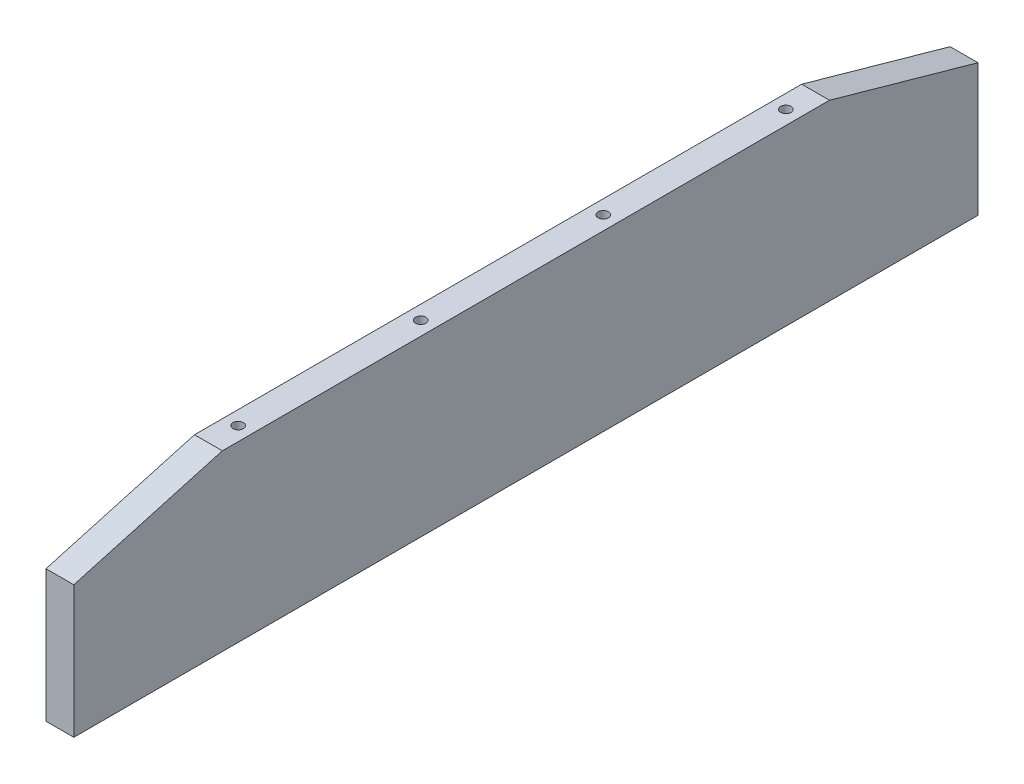
ISO-10303-21;
HEADER;
FILE_DESCRIPTION(('STEP AP214'),'2;1');
FILE_NAME('part.step','',(''),(''),'','','');
FILE_SCHEMA(('AUTOMOTIVE_DESIGN { 1 0 10303 214 1 1 1 1 }'));
ENDSEC;
DATA;
#1=APPLICATION_CONTEXT('core data for automotive mechanical design processes');
#2=APPLICATION_PROTOCOL_DEFINITION('international standard','automotive_design',2000,#1);
#3=PRODUCT_CONTEXT('',#1,'mechanical');
#4=PRODUCT('Part','Part','',(#3));
#5=PRODUCT_RELATED_PRODUCT_CATEGORY('part','',(#4));
#6=PRODUCT_DEFINITION_FORMATION('','',#4);
#7=PRODUCT_DEFINITION_CONTEXT('part definition',#1,'design');
#8=PRODUCT_DEFINITION('design','',#6,#7);
#9=PRODUCT_DEFINITION_SHAPE('','',#8);
#10=(LENGTH_UNIT() NAMED_UNIT(*) SI_UNIT(.MILLI.,.METRE.));
#11=(NAMED_UNIT(*) PLANE_ANGLE_UNIT() SI_UNIT($,.RADIAN.));
#12=(NAMED_UNIT(*) SI_UNIT($,.STERADIAN.) SOLID_ANGLE_UNIT());
#13=UNCERTAINTY_MEASURE_WITH_UNIT(LENGTH_MEASURE(1.E-05),#10,'distance_accuracy_value','');
#14=(GEOMETRIC_REPRESENTATION_CONTEXT(3) GLOBAL_UNCERTAINTY_ASSIGNED_CONTEXT((#13)) GLOBAL_UNIT_ASSIGNED_CONTEXT((#10,
#11,#12)) REPRESENTATION_CONTEXT('',''));
#15=CARTESIAN_POINT('',(0.,0.,0.));
#16=DIRECTION('',(0.,0.,1.));
#17=DIRECTION('',(1.,0.,0.));
#18=AXIS2_PLACEMENT_3D('',#15,#16,#17);
#19=CARTESIAN_POINT('',(8.,37.9952514413731,25.));
#20=DIRECTION('',(0.,0.,-1.));
#21=DIRECTION('',(0.,1.,0.));
#22=AXIS2_PLACEMENT_3D('',#19,#20,#21);
#23=PLANE('',#22);
#24=DIRECTION('',(0.,-1.,0.));
#25=VECTOR('',#24,1.);
#26=CARTESIAN_POINT('',(0.,37.9952514413731,25.));
#27=LINE('',#26,#25);
#28=CARTESIAN_POINT('',(0.,37.9952514413731,25.));
#29=VERTEX_POINT('',#28);
#30=CARTESIAN_POINT('',(0.,0.,25.));
#31=VERTEX_POINT('',#30);
#32=EDGE_CURVE('E117',#29,#31,#27,.T.);
#33=ORIENTED_EDGE('',*,*,#32,.T.);
#34=DIRECTION('',(-1.,0.,0.));
#35=VECTOR('',#34,1.);
#36=CARTESIAN_POINT('',(8.,0.,25.));
#37=LINE('',#36,#35);
#38=CARTESIAN_POINT('',(8.,0.,25.));
#39=VERTEX_POINT('',#38);
#40=EDGE_CURVE('E11',#39,#31,#37,.T.);
#41=ORIENTED_EDGE('',*,*,#40,.F.);
#42=DIRECTION('',(0.,-1.,0.));
#43=VECTOR('',#42,1.);
#44=CARTESIAN_POINT('',(8.,37.9952514413731,25.));
#45=LINE('',#44,#43);
#46=CARTESIAN_POINT('',(8.,37.9952514413731,25.));
#47=VERTEX_POINT('',#46);
#48=EDGE_CURVE('E128',#47,#39,#45,.T.);
#49=ORIENTED_EDGE('',*,*,#48,.F.);
#50=DIRECTION('',(-1.,0.,0.));
#51=VECTOR('',#50,1.);
#52=CARTESIAN_POINT('',(8.,37.9952514413731,25.));
#53=LINE('',#52,#51);
#54=EDGE_CURVE('E113',#47,#29,#53,.T.);
#55=ORIENTED_EDGE('',*,*,#54,.T.);
#56=EDGE_LOOP('',(#33,#41,#49,#55));
#57=FACE_BOUND('',#56,.T.);
#58=ADVANCED_FACE('F33',(#57),#23,.F.);
#59=CARTESIAN_POINT('',(8.,0.,25.));
#60=DIRECTION('',(0.,1.,0.));
#61=DIRECTION('',(0.,0.,1.));
#62=AXIS2_PLACEMENT_3D('',#59,#60,#61);
#63=PLANE('',#62);
#64=CARTESIAN_POINT('',(4.,0.,-183.75));
#65=DIRECTION('',(0.,-1.,0.));
#66=DIRECTION('',(0.,0.,-1.));
#67=AXIS2_PLACEMENT_3D('',#64,#65,#66);
#68=CIRCLE('',#67,1.5);
#69=CARTESIAN_POINT('',(4.,0.,-185.25));
#70=VERTEX_POINT('',#69);
#71=EDGE_CURVE('E242',#70,#70,#68,.T.);
#72=ORIENTED_EDGE('',*,*,#71,.F.);
#73=EDGE_LOOP('',(#72));
#74=FACE_BOUND('',#73,.T.);
#75=CARTESIAN_POINT('',(4.,0.,-131.25));
#76=DIRECTION('',(0.,-1.,0.));
#77=DIRECTION('',(0.,0.,-1.));
#78=AXIS2_PLACEMENT_3D('',#75,#76,#77);
#79=CIRCLE('',#78,1.5);
#80=CARTESIAN_POINT('',(4.,0.,-132.75));
#81=VERTEX_POINT('',#80);
#82=EDGE_CURVE('E244',#81,#81,#79,.T.);
#83=ORIENTED_EDGE('',*,*,#82,.F.);
#84=EDGE_LOOP('',(#83));
#85=FACE_BOUND('',#84,.T.);
#86=CARTESIAN_POINT('',(4.,0.,-78.75));
#87=DIRECTION('',(0.,-1.,0.));
#88=DIRECTION('',(0.,0.,-1.));
#89=AXIS2_PLACEMENT_3D('',#86,#87,#88);
#90=CIRCLE('',#89,1.5);
#91=CARTESIAN_POINT('',(4.,0.,-80.25));
#92=VERTEX_POINT('',#91);
#93=EDGE_CURVE('E250',#92,#92,#90,.T.);
#94=ORIENTED_EDGE('',*,*,#93,.F.);
#95=EDGE_LOOP('',(#94));
#96=FACE_BOUND('',#95,.T.);
#97=CARTESIAN_POINT('',(4.,0.,-26.25));
#98=DIRECTION('',(0.,-1.,0.));
#99=DIRECTION('',(0.,0.,-1.));
#100=AXIS2_PLACEMENT_3D('',#97,#98,#99);
#101=CIRCLE('',#100,1.5);
#102=CARTESIAN_POINT('',(4.,0.,-27.75));
#103=VERTEX_POINT('',#102);
#104=EDGE_CURVE('E256',#103,#103,#101,.T.);
#105=ORIENTED_EDGE('',*,*,#104,.F.);
#106=EDGE_LOOP('',(#105));
#107=FACE_BOUND('',#106,.T.);
#108=DIRECTION('',(0.,0.,-1.));
#109=VECTOR('',#108,1.);
#110=CARTESIAN_POINT('',(0.,0.,25.));
#111=LINE('',#110,#109);
#112=CARTESIAN_POINT('',(0.,0.,-235.));
#113=VERTEX_POINT('',#112);
#114=EDGE_CURVE('E120',#31,#113,#111,.T.);
#115=ORIENTED_EDGE('',*,*,#114,.T.);
#116=DIRECTION('',(-1.,0.,0.));
#117=VECTOR('',#116,1.);
#118=CARTESIAN_POINT('',(8.,0.,-235.));
#119=LINE('',#118,#117);
#120=CARTESIAN_POINT('',(8.,0.,-235.));
#121=VERTEX_POINT('',#120);
#122=EDGE_CURVE('E41',#121,#113,#119,.T.);
#123=ORIENTED_EDGE('',*,*,#122,.F.);
#124=DIRECTION('',(0.,0.,-1.));
#125=VECTOR('',#124,1.);
#126=CARTESIAN_POINT('',(8.,0.,25.));
#127=LINE('',#126,#125);
#128=EDGE_CURVE('E86',#39,#121,#127,.T.);
#129=ORIENTED_EDGE('',*,*,#128,.F.);
#130=ORIENTED_EDGE('',*,*,#40,.T.);
#131=EDGE_LOOP('',(#115,#123,#129,#130));
#132=FACE_BOUND('',#131,.T.);
#133=ADVANCED_FACE('F153',(#74,#85,#96,#107,#132),#63,.F.);
#134=CARTESIAN_POINT('',(8.,0.,-235.));
#135=DIRECTION('',(0.,0.,1.));
#136=DIRECTION('',(1.,0.,0.));
#137=AXIS2_PLACEMENT_3D('',#134,#135,#136);
#138=PLANE('',#137);
#139=DIRECTION('',(0.,1.,0.));
#140=VECTOR('',#139,1.);
#141=CARTESIAN_POINT('',(0.,0.,-235.));
#142=LINE('',#141,#140);
#143=CARTESIAN_POINT('',(0.,37.9952514413731,-235.));
#144=VERTEX_POINT('',#143);
#145=EDGE_CURVE('E123',#113,#144,#142,.T.);
#146=ORIENTED_EDGE('',*,*,#145,.T.);
#147=DIRECTION('',(-1.,0.,0.));
#148=VECTOR('',#147,1.);
#149=CARTESIAN_POINT('',(8.,37.9952514413731,-235.));
#150=LINE('',#149,#148);
#151=CARTESIAN_POINT('',(8.,37.9952514413731,-235.));
#152=VERTEX_POINT('',#151);
#153=EDGE_CURVE('E108',#152,#144,#150,.T.);
#154=ORIENTED_EDGE('',*,*,#153,.F.);
#155=DIRECTION('',(0.,1.,0.));
#156=VECTOR('',#155,1.);
#157=CARTESIAN_POINT('',(8.,0.,-235.));
#158=LINE('',#157,#156);
#159=EDGE_CURVE('E99',#121,#152,#158,.T.);
#160=ORIENTED_EDGE('',*,*,#159,.F.);
#161=ORIENTED_EDGE('',*,*,#122,.T.);
#162=EDGE_LOOP('',(#146,#154,#160,#161));
#163=FACE_BOUND('',#162,.T.);
#164=ADVANCED_FACE('F134',(#163),#138,.F.);
#165=CARTESIAN_POINT('',(8.,37.9952514413731,-235.));
#166=DIRECTION('',(0.,-0.962675452305413,0.270658407459604));
#167=DIRECTION('',(0.,-0.270658407459604,-0.962675452305413));
#168=AXIS2_PLACEMENT_3D('',#165,#166,#167);
#169=PLANE('',#168);
#170=DIRECTION('',(0.,0.270658407459604,0.962675452305413));
#171=VECTOR('',#170,1.);
#172=CARTESIAN_POINT('',(0.,37.9952514413731,-235.));
#173=LINE('',#172,#171);
#174=CARTESIAN_POINT('',(0.,50.,-192.301615505095));
#175=VERTEX_POINT('',#174);
#176=EDGE_CURVE('E107',#144,#175,#173,.T.);
#177=ORIENTED_EDGE('',*,*,#176,.T.);
#178=DIRECTION('',(-1.,0.,0.));
#179=VECTOR('',#178,1.);
#180=CARTESIAN_POINT('',(8.,50.,-192.301615505095));
#181=LINE('',#180,#179);
#182=CARTESIAN_POINT('',(8.,50.,-192.301615505095));
#183=VERTEX_POINT('',#182);
#184=EDGE_CURVE('E104',#183,#175,#181,.T.);
#185=ORIENTED_EDGE('',*,*,#184,.F.);
#186=DIRECTION('',(0.,0.270658407459604,0.962675452305413));
#187=VECTOR('',#186,1.);
#188=CARTESIAN_POINT('',(8.,37.9952514413731,-235.));
#189=LINE('',#188,#187);
#190=EDGE_CURVE('E93',#152,#183,#189,.T.);
#191=ORIENTED_EDGE('',*,*,#190,.F.);
#192=ORIENTED_EDGE('',*,*,#153,.T.);
#193=EDGE_LOOP('',(#177,#185,#191,#192));
#194=FACE_BOUND('',#193,.T.);
#195=ADVANCED_FACE('F105',(#194),#169,.F.);
#196=CARTESIAN_POINT('',(8.,50.,-192.301615505095));
#197=DIRECTION('',(0.,-1.,0.));
#198=DIRECTION('',(0.,0.,-1.));
#199=AXIS2_PLACEMENT_3D('',#196,#197,#198);
#200=PLANE('',#199);
#201=CARTESIAN_POINT('',(4.,50.,-183.75));
#202=DIRECTION('',(0.,-1.,0.));
#203=DIRECTION('',(0.,0.,-1.));
#204=AXIS2_PLACEMENT_3D('',#201,#202,#203);
#205=CIRCLE('',#204,1.5);
#206=CARTESIAN_POINT('',(4.,50.,-185.25));
#207=VERTEX_POINT('',#206);
#208=EDGE_CURVE('E240',#207,#207,#205,.T.);
#209=ORIENTED_EDGE('',*,*,#208,.T.);
#210=EDGE_LOOP('',(#209));
#211=FACE_BOUND('',#210,.T.);
#212=CARTESIAN_POINT('',(4.,50.,-131.25));
#213=DIRECTION('',(0.,-1.,0.));
#214=DIRECTION('',(0.,0.,-1.));
#215=AXIS2_PLACEMENT_3D('',#212,#213,#214);
#216=CIRCLE('',#215,1.5);
#217=CARTESIAN_POINT('',(4.,50.,-132.75));
#218=VERTEX_POINT('',#217);
#219=EDGE_CURVE('E247',#218,#218,#216,.T.);
#220=ORIENTED_EDGE('',*,*,#219,.T.);
#221=EDGE_LOOP('',(#220));
#222=FACE_BOUND('',#221,.T.);
#223=CARTESIAN_POINT('',(4.,50.,-78.75));
#224=DIRECTION('',(0.,-1.,0.));
#225=DIRECTION('',(0.,0.,-1.));
#226=AXIS2_PLACEMENT_3D('',#223,#224,#225);
#227=CIRCLE('',#226,1.5);
#228=CARTESIAN_POINT('',(4.,50.,-80.25));
#229=VERTEX_POINT('',#228);
#230=EDGE_CURVE('E253',#229,#229,#227,.T.);
#231=ORIENTED_EDGE('',*,*,#230,.T.);
#232=EDGE_LOOP('',(#231));
#233=FACE_BOUND('',#232,.T.);
#234=CARTESIAN_POINT('',(4.,50.,-26.25));
#235=DIRECTION('',(0.,-1.,0.));
#236=DIRECTION('',(0.,0.,-1.));
#237=AXIS2_PLACEMENT_3D('',#234,#235,#236);
#238=CIRCLE('',#237,1.5);
#239=CARTESIAN_POINT('',(4.,50.,-27.75));
#240=VERTEX_POINT('',#239);
#241=EDGE_CURVE('E121',#240,#240,#238,.T.);
#242=ORIENTED_EDGE('',*,*,#241,.T.);
#243=EDGE_LOOP('',(#242));
#244=FACE_BOUND('',#243,.T.);
#245=DIRECTION('',(0.,0.,1.));
#246=VECTOR('',#245,1.);
#247=CARTESIAN_POINT('',(0.,50.,-192.301615505095));
#248=LINE('',#247,#246);
#249=CARTESIAN_POINT('',(0.,50.,-17.6983844949055));
#250=VERTEX_POINT('',#249);
#251=EDGE_CURVE('E72',#175,#250,#248,.T.);
#252=ORIENTED_EDGE('',*,*,#251,.T.);
#253=DIRECTION('',(-1.,0.,0.));
#254=VECTOR('',#253,1.);
#255=CARTESIAN_POINT('',(8.,50.,-17.6983844949055));
#256=LINE('',#255,#254);
#257=CARTESIAN_POINT('',(8.,50.,-17.6983844949055));
#258=VERTEX_POINT('',#257);
#259=EDGE_CURVE('E109',#258,#250,#256,.T.);
#260=ORIENTED_EDGE('',*,*,#259,.F.);
#261=DIRECTION('',(0.,0.,1.));
#262=VECTOR('',#261,1.);
#263=CARTESIAN_POINT('',(8.,50.,-192.301615505095));
#264=LINE('',#263,#262);
#265=EDGE_CURVE('E97',#183,#258,#264,.T.);
#266=ORIENTED_EDGE('',*,*,#265,.F.);
#267=ORIENTED_EDGE('',*,*,#184,.T.);
#268=EDGE_LOOP('',(#252,#260,#266,#267));
#269=FACE_BOUND('',#268,.T.);
#270=ADVANCED_FACE('F111',(#211,#222,#233,#244,#269),#200,.F.);
#271=CARTESIAN_POINT('',(8.,50.,-17.6983844949055));
#272=DIRECTION('',(0.,-0.962675452305413,-0.270658407459604));
#273=DIRECTION('',(0.,0.270658407459604,-0.962675452305413));
#274=AXIS2_PLACEMENT_3D('',#271,#272,#273);
#275=PLANE('',#274);
#276=DIRECTION('',(0.,-0.270658407459604,0.962675452305413));
#277=VECTOR('',#276,1.);
#278=CARTESIAN_POINT('',(0.,50.,-17.6983844949055));
#279=LINE('',#278,#277);
#280=EDGE_CURVE('E78',#250,#29,#279,.T.);
#281=ORIENTED_EDGE('',*,*,#280,.T.);
#282=ORIENTED_EDGE('',*,*,#54,.F.);
#283=DIRECTION('',(0.,-0.270658407459604,0.962675452305413));
#284=VECTOR('',#283,1.);
#285=CARTESIAN_POINT('',(8.,50.,-17.6983844949055));
#286=LINE('',#285,#284);
#287=EDGE_CURVE('E49',#258,#47,#286,.T.);
#288=ORIENTED_EDGE('',*,*,#287,.F.);
#289=ORIENTED_EDGE('',*,*,#259,.T.);
#290=EDGE_LOOP('',(#281,#282,#288,#289));
#291=FACE_BOUND('',#290,.T.);
#292=ADVANCED_FACE('F141',(#291),#275,.F.);
#293=CARTESIAN_POINT('',(8.,0.,0.));
#294=DIRECTION('',(1.,0.,0.));
#295=DIRECTION('',(0.,0.,-1.));
#296=AXIS2_PLACEMENT_3D('',#293,#294,#295);
#297=PLANE('',#296);
#298=ORIENTED_EDGE('',*,*,#48,.T.);
#299=ORIENTED_EDGE('',*,*,#128,.T.);
#300=ORIENTED_EDGE('',*,*,#159,.T.);
#301=ORIENTED_EDGE('',*,*,#190,.T.);
#302=ORIENTED_EDGE('',*,*,#265,.T.);
#303=ORIENTED_EDGE('',*,*,#287,.T.);
#304=EDGE_LOOP('',(#298,#299,#300,#301,#302,#303));
#305=FACE_BOUND('',#304,.T.);
#306=ADVANCED_FACE('F95',(#305),#297,.T.);
#307=CARTESIAN_POINT('',(0.,0.,0.));
#308=DIRECTION('',(1.,0.,0.));
#309=DIRECTION('',(0.,0.,-1.));
#310=AXIS2_PLACEMENT_3D('',#307,#308,#309);
#311=PLANE('',#310);
#312=ORIENTED_EDGE('',*,*,#32,.F.);
#313=ORIENTED_EDGE('',*,*,#280,.F.);
#314=ORIENTED_EDGE('',*,*,#251,.F.);
#315=ORIENTED_EDGE('',*,*,#176,.F.);
#316=ORIENTED_EDGE('',*,*,#145,.F.);
#317=ORIENTED_EDGE('',*,*,#114,.F.);
#318=EDGE_LOOP('',(#312,#313,#314,#315,#316,#317));
#319=FACE_BOUND('',#318,.T.);
#320=ADVANCED_FACE('F137',(#319),#311,.F.);
#321=CARTESIAN_POINT('',(4.,50.,-26.25));
#322=DIRECTION('',(0.,-1.,0.));
#323=DIRECTION('',(0.,0.,-1.));
#324=AXIS2_PLACEMENT_3D('',#321,#322,#323);
#325=CYLINDRICAL_SURFACE('',#324,1.5);
#326=ORIENTED_EDGE('',*,*,#241,.F.);
#327=EDGE_LOOP('',(#326));
#328=FACE_BOUND('',#327,.T.);
#329=ORIENTED_EDGE('',*,*,#104,.T.);
#330=EDGE_LOOP('',(#329));
#331=FACE_BOUND('',#330,.T.);
#332=ADVANCED_FACE('F183',(#328,#331),#325,.F.);
#333=CARTESIAN_POINT('',(4.,50.,-78.75));
#334=DIRECTION('',(0.,-1.,0.));
#335=DIRECTION('',(0.,0.,-1.));
#336=AXIS2_PLACEMENT_3D('',#333,#334,#335);
#337=CYLINDRICAL_SURFACE('',#336,1.5);
#338=ORIENTED_EDGE('',*,*,#230,.F.);
#339=EDGE_LOOP('',(#338));
#340=FACE_BOUND('',#339,.T.);
#341=ORIENTED_EDGE('',*,*,#93,.T.);
#342=EDGE_LOOP('',(#341));
#343=FACE_BOUND('',#342,.T.);
#344=ADVANCED_FACE('F188',(#340,#343),#337,.F.);
#345=CARTESIAN_POINT('',(4.,50.,-131.25));
#346=DIRECTION('',(0.,-1.,0.));
#347=DIRECTION('',(0.,0.,-1.));
#348=AXIS2_PLACEMENT_3D('',#345,#346,#347);
#349=CYLINDRICAL_SURFACE('',#348,1.5);
#350=ORIENTED_EDGE('',*,*,#219,.F.);
#351=EDGE_LOOP('',(#350));
#352=FACE_BOUND('',#351,.T.);
#353=ORIENTED_EDGE('',*,*,#82,.T.);
#354=EDGE_LOOP('',(#353));
#355=FACE_BOUND('',#354,.T.);
#356=ADVANCED_FACE('F200',(#352,#355),#349,.F.);
#357=CARTESIAN_POINT('',(4.,50.,-183.75));
#358=DIRECTION('',(0.,-1.,0.));
#359=DIRECTION('',(0.,0.,-1.));
#360=AXIS2_PLACEMENT_3D('',#357,#358,#359);
#361=CYLINDRICAL_SURFACE('',#360,1.5);
#362=ORIENTED_EDGE('',*,*,#208,.F.);
#363=EDGE_LOOP('',(#362));
#364=FACE_BOUND('',#363,.T.);
#365=ORIENTED_EDGE('',*,*,#71,.T.);
#366=EDGE_LOOP('',(#365));
#367=FACE_BOUND('',#366,.T.);
#368=ADVANCED_FACE('F210',(#364,#367),#361,.F.);
#369=CLOSED_SHELL('',(#58,#133,#164,#195,#270,#292,#306,#320,#332,#344,#356,#368));
#370=MANIFOLD_SOLID_BREP('B2',#369);
#371=ADVANCED_BREP_SHAPE_REPRESENTATION('',(#18,#370),#14);
#372=SHAPE_DEFINITION_REPRESENTATION(#9,#371);
ENDSEC;
END-ISO-10303-21;
